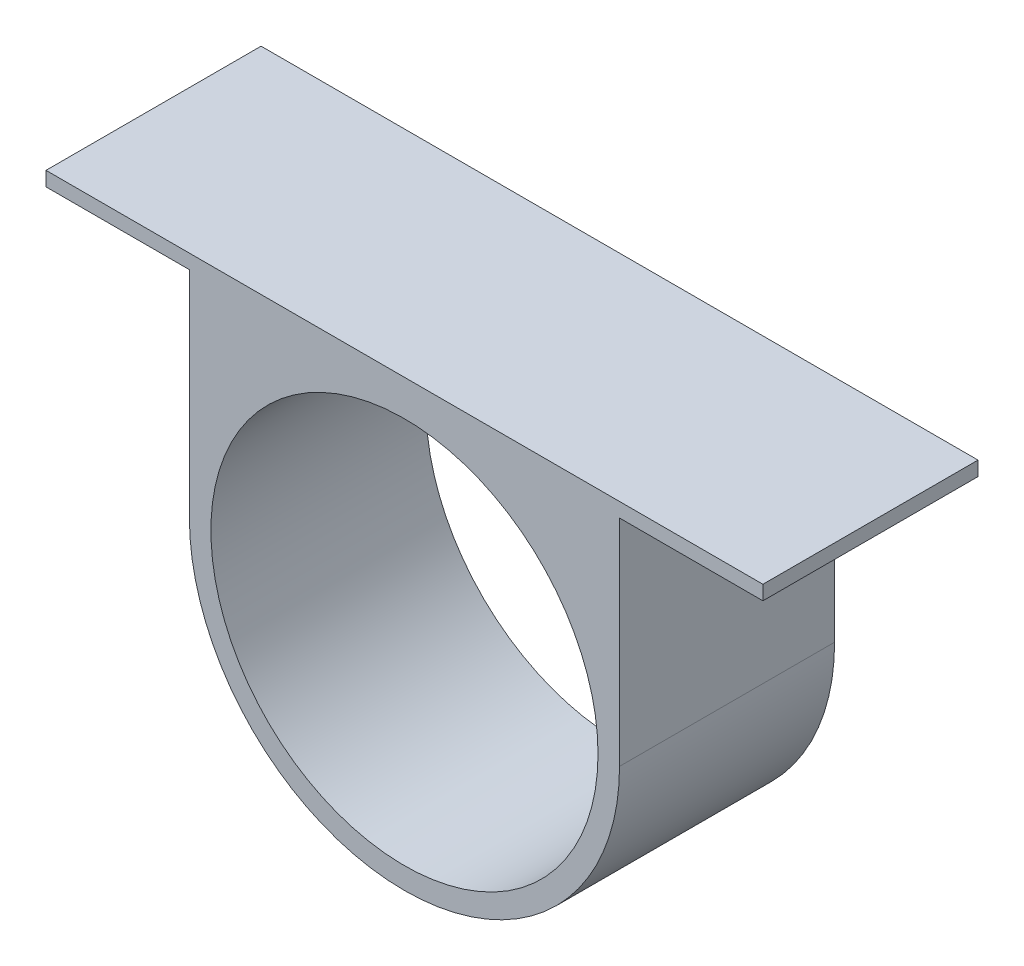
ISO-10303-21;
HEADER;
FILE_DESCRIPTION(('STEP AP214'),'2;1');
FILE_NAME('part.step','',(''),(''),'','','');
FILE_SCHEMA(('AUTOMOTIVE_DESIGN { 1 0 10303 214 1 1 1 1 }'));
ENDSEC;
DATA;
#1=APPLICATION_CONTEXT('core data for automotive mechanical design processes');
#2=APPLICATION_PROTOCOL_DEFINITION('international standard','automotive_design',2000,#1);
#3=PRODUCT_CONTEXT('',#1,'mechanical');
#4=PRODUCT('Part','Part','',(#3));
#5=PRODUCT_RELATED_PRODUCT_CATEGORY('part','',(#4));
#6=PRODUCT_DEFINITION_FORMATION('','',#4);
#7=PRODUCT_DEFINITION_CONTEXT('part definition',#1,'design');
#8=PRODUCT_DEFINITION('design','',#6,#7);
#9=PRODUCT_DEFINITION_SHAPE('','',#8);
#10=(LENGTH_UNIT() NAMED_UNIT(*) SI_UNIT(.MILLI.,.METRE.));
#11=(NAMED_UNIT(*) PLANE_ANGLE_UNIT() SI_UNIT($,.RADIAN.));
#12=(NAMED_UNIT(*) SI_UNIT($,.STERADIAN.) SOLID_ANGLE_UNIT());
#13=UNCERTAINTY_MEASURE_WITH_UNIT(LENGTH_MEASURE(1.E-05),#10,'distance_accuracy_value','');
#14=(GEOMETRIC_REPRESENTATION_CONTEXT(3) GLOBAL_UNCERTAINTY_ASSIGNED_CONTEXT((#13)) GLOBAL_UNIT_ASSIGNED_CONTEXT((#10,
#11,#12)) REPRESENTATION_CONTEXT('',''));
#15=CARTESIAN_POINT('',(0.,0.,0.));
#16=DIRECTION('',(0.,0.,1.));
#17=DIRECTION('',(1.,0.,0.));
#18=AXIS2_PLACEMENT_3D('',#15,#16,#17);
#19=CARTESIAN_POINT('',(0.,0.,15.));
#20=DIRECTION('',(0.,0.,1.));
#21=DIRECTION('',(1.,0.,0.));
#22=AXIS2_PLACEMENT_3D('',#19,#20,#21);
#23=PLANE('',#22);
#24=DIRECTION('',(0.,1.,0.));
#25=VECTOR('',#24,1.);
#26=CARTESIAN_POINT('',(25.,15.,15.));
#27=LINE('',#26,#25);
#28=CARTESIAN_POINT('',(25.,15.,15.));
#29=VERTEX_POINT('',#28);
#30=CARTESIAN_POINT('',(25.,16.,15.));
#31=VERTEX_POINT('',#30);
#32=EDGE_CURVE('E145',#29,#31,#27,.T.);
#33=ORIENTED_EDGE('',*,*,#32,.T.);
#34=DIRECTION('',(-1.,0.,0.));
#35=VECTOR('',#34,1.);
#36=CARTESIAN_POINT('',(-25.,16.,15.));
#37=LINE('',#36,#35);
#38=CARTESIAN_POINT('',(-25.,16.,15.));
#39=VERTEX_POINT('',#38);
#40=EDGE_CURVE('E93',#31,#39,#37,.T.);
#41=ORIENTED_EDGE('',*,*,#40,.T.);
#42=DIRECTION('',(0.,-1.,0.));
#43=VECTOR('',#42,1.);
#44=CARTESIAN_POINT('',(-25.,15.,15.));
#45=LINE('',#44,#43);
#46=CARTESIAN_POINT('',(-25.,15.,15.));
#47=VERTEX_POINT('',#46);
#48=EDGE_CURVE('E160',#39,#47,#45,.T.);
#49=ORIENTED_EDGE('',*,*,#48,.T.);
#50=DIRECTION('',(1.,0.,0.));
#51=VECTOR('',#50,1.);
#52=CARTESIAN_POINT('',(-15.,15.,15.));
#53=LINE('',#52,#51);
#54=CARTESIAN_POINT('',(-15.,15.,15.));
#55=VERTEX_POINT('',#54);
#56=EDGE_CURVE('E173',#47,#55,#53,.T.);
#57=ORIENTED_EDGE('',*,*,#56,.T.);
#58=DIRECTION('',(0.,-1.,0.));
#59=VECTOR('',#58,1.);
#60=CARTESIAN_POINT('',(-15.,0.,15.));
#61=LINE('',#60,#59);
#62=CARTESIAN_POINT('',(-15.,0.,15.));
#63=VERTEX_POINT('',#62);
#64=EDGE_CURVE('E112',#55,#63,#61,.T.);
#65=ORIENTED_EDGE('',*,*,#64,.T.);
#66=CARTESIAN_POINT('',(0.,0.,15.));
#67=DIRECTION('',(0.,0.,1.));
#68=DIRECTION('',(1.,0.,0.));
#69=AXIS2_PLACEMENT_3D('',#66,#67,#68);
#70=CIRCLE('',#69,15.);
#71=CARTESIAN_POINT('',(15.,0.,15.));
#72=VERTEX_POINT('',#71);
#73=EDGE_CURVE('E106',#63,#72,#70,.T.);
#74=ORIENTED_EDGE('',*,*,#73,.T.);
#75=DIRECTION('',(0.,1.,0.));
#76=VECTOR('',#75,1.);
#77=CARTESIAN_POINT('',(15.,0.,15.));
#78=LINE('',#77,#76);
#79=CARTESIAN_POINT('',(15.,15.,15.));
#80=VERTEX_POINT('',#79);
#81=EDGE_CURVE('E110',#72,#80,#78,.T.);
#82=ORIENTED_EDGE('',*,*,#81,.T.);
#83=DIRECTION('',(1.,0.,0.));
#84=VECTOR('',#83,1.);
#85=CARTESIAN_POINT('',(15.,15.,15.));
#86=LINE('',#85,#84);
#87=EDGE_CURVE('E50',#80,#29,#86,.T.);
#88=ORIENTED_EDGE('',*,*,#87,.T.);
#89=EDGE_LOOP('',(#33,#41,#49,#57,#65,#74,#82,#88));
#90=FACE_BOUND('',#89,.T.);
#91=CARTESIAN_POINT('',(0.,0.,15.));
#92=DIRECTION('',(0.,0.,1.));
#93=DIRECTION('',(1.,0.,0.));
#94=AXIS2_PLACEMENT_3D('',#91,#92,#93);
#95=CIRCLE('',#94,13.5);
#96=CARTESIAN_POINT('',(13.5,0.,15.));
#97=VERTEX_POINT('',#96);
#98=EDGE_CURVE('E134',#97,#97,#95,.T.);
#99=ORIENTED_EDGE('',*,*,#98,.F.);
#100=EDGE_LOOP('',(#99));
#101=FACE_BOUND('',#100,.T.);
#102=ADVANCED_FACE('F33',(#90,#101),#23,.T.);
#103=CARTESIAN_POINT('',(0.,0.,0.));
#104=DIRECTION('',(0.,0.,1.));
#105=DIRECTION('',(1.,0.,0.));
#106=AXIS2_PLACEMENT_3D('',#103,#104,#105);
#107=PLANE('',#106);
#108=DIRECTION('',(0.,1.,0.));
#109=VECTOR('',#108,1.);
#110=CARTESIAN_POINT('',(25.,15.,0.));
#111=LINE('',#110,#109);
#112=CARTESIAN_POINT('',(25.,15.,0.));
#113=VERTEX_POINT('',#112);
#114=CARTESIAN_POINT('',(25.,16.,0.));
#115=VERTEX_POINT('',#114);
#116=EDGE_CURVE('E130',#113,#115,#111,.T.);
#117=ORIENTED_EDGE('',*,*,#116,.F.);
#118=DIRECTION('',(1.,0.,0.));
#119=VECTOR('',#118,1.);
#120=CARTESIAN_POINT('',(15.,15.,0.));
#121=LINE('',#120,#119);
#122=CARTESIAN_POINT('',(15.,15.,0.));
#123=VERTEX_POINT('',#122);
#124=EDGE_CURVE('E85',#123,#113,#121,.T.);
#125=ORIENTED_EDGE('',*,*,#124,.F.);
#126=DIRECTION('',(0.,1.,0.));
#127=VECTOR('',#126,1.);
#128=CARTESIAN_POINT('',(15.,0.,0.));
#129=LINE('',#128,#127);
#130=CARTESIAN_POINT('',(15.,0.,0.));
#131=VERTEX_POINT('',#130);
#132=EDGE_CURVE('E79',#131,#123,#129,.T.);
#133=ORIENTED_EDGE('',*,*,#132,.F.);
#134=CARTESIAN_POINT('',(0.,0.,0.));
#135=DIRECTION('',(0.,0.,1.));
#136=DIRECTION('',(1.,0.,0.));
#137=AXIS2_PLACEMENT_3D('',#134,#135,#136);
#138=CIRCLE('',#137,15.);
#139=CARTESIAN_POINT('',(-15.,0.,0.));
#140=VERTEX_POINT('',#139);
#141=EDGE_CURVE('E120',#140,#131,#138,.T.);
#142=ORIENTED_EDGE('',*,*,#141,.F.);
#143=DIRECTION('',(0.,-1.,0.));
#144=VECTOR('',#143,1.);
#145=CARTESIAN_POINT('',(-15.,0.,0.));
#146=LINE('',#145,#144);
#147=CARTESIAN_POINT('',(-15.,15.,0.));
#148=VERTEX_POINT('',#147);
#149=EDGE_CURVE('E140',#148,#140,#146,.T.);
#150=ORIENTED_EDGE('',*,*,#149,.F.);
#151=DIRECTION('',(1.,0.,0.));
#152=VECTOR('',#151,1.);
#153=CARTESIAN_POINT('',(-15.,15.,0.));
#154=LINE('',#153,#152);
#155=CARTESIAN_POINT('',(-25.,15.,0.));
#156=VERTEX_POINT('',#155);
#157=EDGE_CURVE('E138',#156,#148,#154,.T.);
#158=ORIENTED_EDGE('',*,*,#157,.F.);
#159=DIRECTION('',(0.,-1.,0.));
#160=VECTOR('',#159,1.);
#161=CARTESIAN_POINT('',(-25.,15.,0.));
#162=LINE('',#161,#160);
#163=CARTESIAN_POINT('',(-25.,16.,0.));
#164=VERTEX_POINT('',#163);
#165=EDGE_CURVE('E136',#164,#156,#162,.T.);
#166=ORIENTED_EDGE('',*,*,#165,.F.);
#167=DIRECTION('',(-1.,0.,0.));
#168=VECTOR('',#167,1.);
#169=CARTESIAN_POINT('',(-25.,16.,0.));
#170=LINE('',#169,#168);
#171=EDGE_CURVE('E133',#115,#164,#170,.T.);
#172=ORIENTED_EDGE('',*,*,#171,.F.);
#173=EDGE_LOOP('',(#117,#125,#133,#142,#150,#158,#166,#172));
#174=FACE_BOUND('',#173,.T.);
#175=CARTESIAN_POINT('',(0.,0.,0.));
#176=DIRECTION('',(0.,0.,1.));
#177=DIRECTION('',(1.,0.,0.));
#178=AXIS2_PLACEMENT_3D('',#175,#176,#177);
#179=CIRCLE('',#178,13.5);
#180=CARTESIAN_POINT('',(13.5,0.,0.));
#181=VERTEX_POINT('',#180);
#182=EDGE_CURVE('E179',#181,#181,#179,.T.);
#183=ORIENTED_EDGE('',*,*,#182,.T.);
#184=EDGE_LOOP('',(#183));
#185=FACE_BOUND('',#184,.T.);
#186=ADVANCED_FACE('F164',(#174,#185),#107,.F.);
#187=CARTESIAN_POINT('',(25.,15.,15.));
#188=DIRECTION('',(-1.,0.,0.));
#189=DIRECTION('',(0.,-1.,0.));
#190=AXIS2_PLACEMENT_3D('',#187,#188,#189);
#191=PLANE('',#190);
#192=ORIENTED_EDGE('',*,*,#116,.T.);
#193=DIRECTION('',(0.,0.,-1.));
#194=VECTOR('',#193,1.);
#195=CARTESIAN_POINT('',(25.,16.,15.));
#196=LINE('',#195,#194);
#197=EDGE_CURVE('E11',#31,#115,#196,.T.);
#198=ORIENTED_EDGE('',*,*,#197,.F.);
#199=ORIENTED_EDGE('',*,*,#32,.F.);
#200=DIRECTION('',(0.,0.,-1.));
#201=VECTOR('',#200,1.);
#202=CARTESIAN_POINT('',(25.,15.,15.));
#203=LINE('',#202,#201);
#204=EDGE_CURVE('E126',#29,#113,#203,.T.);
#205=ORIENTED_EDGE('',*,*,#204,.T.);
#206=EDGE_LOOP('',(#192,#198,#199,#205));
#207=FACE_BOUND('',#206,.T.);
#208=ADVANCED_FACE('F35',(#207),#191,.F.);
#209=CARTESIAN_POINT('',(-25.,16.,15.));
#210=DIRECTION('',(0.,-1.,0.));
#211=DIRECTION('',(1.,0.,0.));
#212=AXIS2_PLACEMENT_3D('',#209,#210,#211);
#213=PLANE('',#212);
#214=ORIENTED_EDGE('',*,*,#171,.T.);
#215=DIRECTION('',(0.,0.,-1.));
#216=VECTOR('',#215,1.);
#217=CARTESIAN_POINT('',(-25.,16.,15.));
#218=LINE('',#217,#216);
#219=EDGE_CURVE('E42',#39,#164,#218,.T.);
#220=ORIENTED_EDGE('',*,*,#219,.F.);
#221=ORIENTED_EDGE('',*,*,#40,.F.);
#222=ORIENTED_EDGE('',*,*,#197,.T.);
#223=EDGE_LOOP('',(#214,#220,#221,#222));
#224=FACE_BOUND('',#223,.T.);
#225=ADVANCED_FACE('F207',(#224),#213,.F.);
#226=CARTESIAN_POINT('',(-25.,15.,15.));
#227=DIRECTION('',(1.,0.,0.));
#228=DIRECTION('',(0.,1.,0.));
#229=AXIS2_PLACEMENT_3D('',#226,#227,#228);
#230=PLANE('',#229);
#231=ORIENTED_EDGE('',*,*,#165,.T.);
#232=DIRECTION('',(0.,0.,-1.));
#233=VECTOR('',#232,1.);
#234=CARTESIAN_POINT('',(-25.,15.,15.));
#235=LINE('',#234,#233);
#236=EDGE_CURVE('E152',#47,#156,#235,.T.);
#237=ORIENTED_EDGE('',*,*,#236,.F.);
#238=ORIENTED_EDGE('',*,*,#48,.F.);
#239=ORIENTED_EDGE('',*,*,#219,.T.);
#240=EDGE_LOOP('',(#231,#237,#238,#239));
#241=FACE_BOUND('',#240,.T.);
#242=ADVANCED_FACE('F158',(#241),#230,.F.);
#243=CARTESIAN_POINT('',(-15.,15.,15.));
#244=DIRECTION('',(0.,1.,0.));
#245=DIRECTION('',(-1.,0.,0.));
#246=AXIS2_PLACEMENT_3D('',#243,#244,#245);
#247=PLANE('',#246);
#248=ORIENTED_EDGE('',*,*,#157,.T.);
#249=DIRECTION('',(0.,0.,-1.));
#250=VECTOR('',#249,1.);
#251=CARTESIAN_POINT('',(-15.,15.,15.));
#252=LINE('',#251,#250);
#253=EDGE_CURVE('E149',#55,#148,#252,.T.);
#254=ORIENTED_EDGE('',*,*,#253,.F.);
#255=ORIENTED_EDGE('',*,*,#56,.F.);
#256=ORIENTED_EDGE('',*,*,#236,.T.);
#257=EDGE_LOOP('',(#248,#254,#255,#256));
#258=FACE_BOUND('',#257,.T.);
#259=ADVANCED_FACE('F169',(#258),#247,.F.);
#260=CARTESIAN_POINT('',(-15.,0.,15.));
#261=DIRECTION('',(1.,0.,0.));
#262=DIRECTION('',(0.,0.,-1.));
#263=AXIS2_PLACEMENT_3D('',#260,#261,#262);
#264=PLANE('',#263);
#265=ORIENTED_EDGE('',*,*,#149,.T.);
#266=DIRECTION('',(0.,0.,-1.));
#267=VECTOR('',#266,1.);
#268=CARTESIAN_POINT('',(-15.,0.,15.));
#269=LINE('',#268,#267);
#270=EDGE_CURVE('E121',#63,#140,#269,.T.);
#271=ORIENTED_EDGE('',*,*,#270,.F.);
#272=ORIENTED_EDGE('',*,*,#64,.F.);
#273=ORIENTED_EDGE('',*,*,#253,.T.);
#274=EDGE_LOOP('',(#265,#271,#272,#273));
#275=FACE_BOUND('',#274,.T.);
#276=ADVANCED_FACE('F172',(#275),#264,.F.);
#277=CARTESIAN_POINT('',(0.,0.,15.));
#278=DIRECTION('',(0.,0.,-1.));
#279=DIRECTION('',(-1.,0.,0.));
#280=AXIS2_PLACEMENT_3D('',#277,#278,#279);
#281=CYLINDRICAL_SURFACE('',#280,15.);
#282=ORIENTED_EDGE('',*,*,#141,.T.);
#283=DIRECTION('',(0.,0.,-1.));
#284=VECTOR('',#283,1.);
#285=CARTESIAN_POINT('',(15.,0.,15.));
#286=LINE('',#285,#284);
#287=EDGE_CURVE('E117',#72,#131,#286,.T.);
#288=ORIENTED_EDGE('',*,*,#287,.F.);
#289=ORIENTED_EDGE('',*,*,#73,.F.);
#290=ORIENTED_EDGE('',*,*,#270,.T.);
#291=EDGE_LOOP('',(#282,#288,#289,#290));
#292=FACE_BOUND('',#291,.T.);
#293=ADVANCED_FACE('F118',(#292),#281,.T.);
#294=CARTESIAN_POINT('',(15.,0.,15.));
#295=DIRECTION('',(-1.,0.,0.));
#296=DIRECTION('',(0.,-1.,0.));
#297=AXIS2_PLACEMENT_3D('',#294,#295,#296);
#298=PLANE('',#297);
#299=ORIENTED_EDGE('',*,*,#132,.T.);
#300=DIRECTION('',(0.,0.,-1.));
#301=VECTOR('',#300,1.);
#302=CARTESIAN_POINT('',(15.,15.,15.));
#303=LINE('',#302,#301);
#304=EDGE_CURVE('E122',#80,#123,#303,.T.);
#305=ORIENTED_EDGE('',*,*,#304,.F.);
#306=ORIENTED_EDGE('',*,*,#81,.F.);
#307=ORIENTED_EDGE('',*,*,#287,.T.);
#308=EDGE_LOOP('',(#299,#305,#306,#307));
#309=FACE_BOUND('',#308,.T.);
#310=ADVANCED_FACE('F124',(#309),#298,.F.);
#311=CARTESIAN_POINT('',(15.,15.,15.));
#312=DIRECTION('',(0.,1.,0.));
#313=DIRECTION('',(-1.,0.,0.));
#314=AXIS2_PLACEMENT_3D('',#311,#312,#313);
#315=PLANE('',#314);
#316=ORIENTED_EDGE('',*,*,#124,.T.);
#317=ORIENTED_EDGE('',*,*,#204,.F.);
#318=ORIENTED_EDGE('',*,*,#87,.F.);
#319=ORIENTED_EDGE('',*,*,#304,.T.);
#320=EDGE_LOOP('',(#316,#317,#318,#319));
#321=FACE_BOUND('',#320,.T.);
#322=ADVANCED_FACE('F195',(#321),#315,.F.);
#323=CARTESIAN_POINT('',(0.,0.,15.));
#324=DIRECTION('',(0.,0.,-1.));
#325=DIRECTION('',(-1.,0.,0.));
#326=AXIS2_PLACEMENT_3D('',#323,#324,#325);
#327=CYLINDRICAL_SURFACE('',#326,13.5);
#328=ORIENTED_EDGE('',*,*,#98,.T.);
#329=EDGE_LOOP('',(#328));
#330=FACE_BOUND('',#329,.T.);
#331=ORIENTED_EDGE('',*,*,#182,.F.);
#332=EDGE_LOOP('',(#331));
#333=FACE_BOUND('',#332,.T.);
#334=ADVANCED_FACE('F185',(#330,#333),#327,.F.);
#335=CLOSED_SHELL('',(#102,#186,#208,#225,#242,#259,#276,#293,#310,#322,#334));
#336=MANIFOLD_SOLID_BREP('B2',#335);
#337=ADVANCED_BREP_SHAPE_REPRESENTATION('',(#18,#336),#14);
#338=SHAPE_DEFINITION_REPRESENTATION(#9,#337);
ENDSEC;
END-ISO-10303-21;
